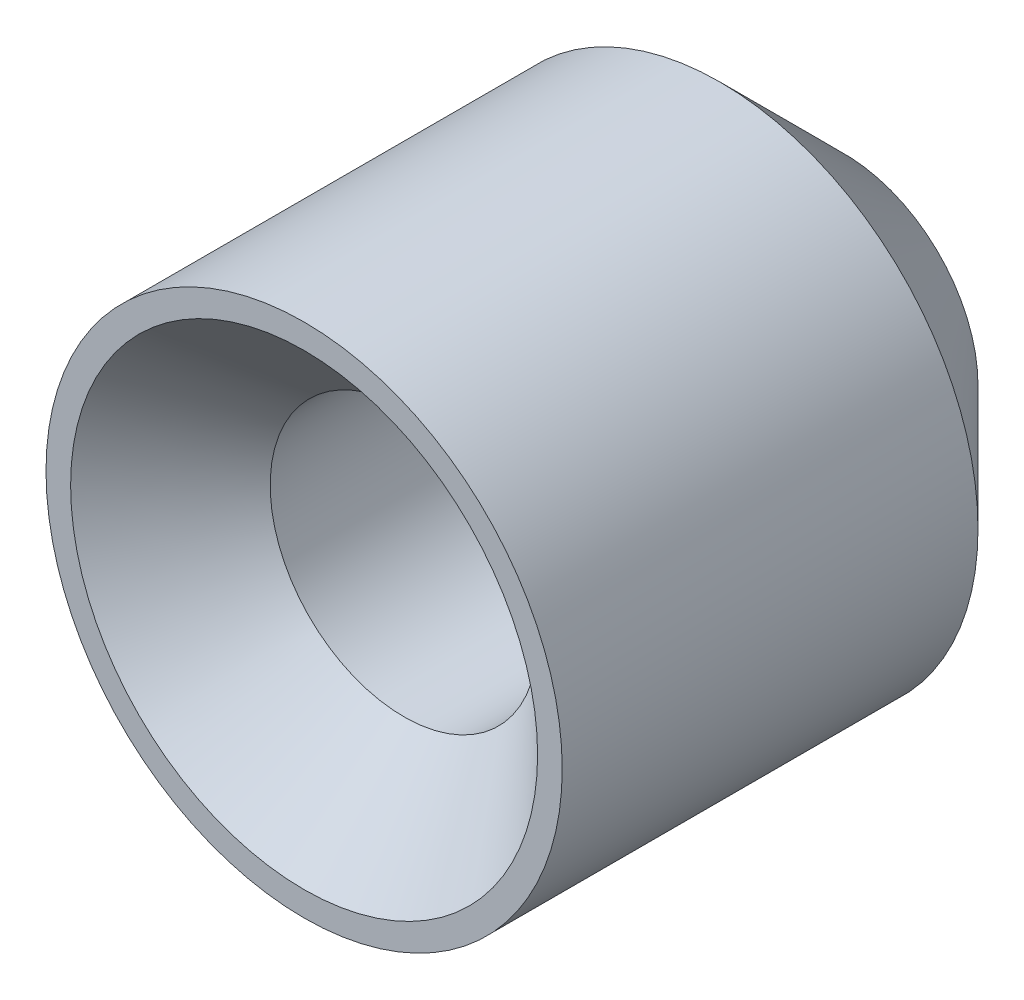
ISO-10303-21;
HEADER;
FILE_DESCRIPTION(('STEP AP214'),'2;1');
FILE_NAME('part.step','',(''),(''),'','','');
FILE_SCHEMA(('AUTOMOTIVE_DESIGN { 1 0 10303 214 1 1 1 1 }'));
ENDSEC;
DATA;
#1=APPLICATION_CONTEXT('core data for automotive mechanical design processes');
#2=APPLICATION_PROTOCOL_DEFINITION('international standard','automotive_design',2000,#1);
#3=PRODUCT_CONTEXT('',#1,'mechanical');
#4=PRODUCT('Part','Part','',(#3));
#5=PRODUCT_RELATED_PRODUCT_CATEGORY('part','',(#4));
#6=PRODUCT_DEFINITION_FORMATION('','',#4);
#7=PRODUCT_DEFINITION_CONTEXT('part definition',#1,'design');
#8=PRODUCT_DEFINITION('design','',#6,#7);
#9=PRODUCT_DEFINITION_SHAPE('','',#8);
#10=(LENGTH_UNIT() NAMED_UNIT(*) SI_UNIT(.MILLI.,.METRE.));
#11=(NAMED_UNIT(*) PLANE_ANGLE_UNIT() SI_UNIT($,.RADIAN.));
#12=(NAMED_UNIT(*) SI_UNIT($,.STERADIAN.) SOLID_ANGLE_UNIT());
#13=UNCERTAINTY_MEASURE_WITH_UNIT(LENGTH_MEASURE(1.E-05),#10,'distance_accuracy_value','');
#14=(GEOMETRIC_REPRESENTATION_CONTEXT(3) GLOBAL_UNCERTAINTY_ASSIGNED_CONTEXT((#13)) GLOBAL_UNIT_ASSIGNED_CONTEXT((#10,
#11,#12)) REPRESENTATION_CONTEXT('',''));
#15=CARTESIAN_POINT('',(0.,0.,0.));
#16=DIRECTION('',(0.,0.,1.));
#17=DIRECTION('',(1.,0.,0.));
#18=AXIS2_PLACEMENT_3D('',#15,#16,#17);
#19=CARTESIAN_POINT('',(-11.1939900407841,3.08591076799993,7.9375));
#20=DIRECTION('',(0.,0.,-1.));
#21=DIRECTION('',(-1.,0.,0.));
#22=AXIS2_PLACEMENT_3D('',#19,#20,#21);
#23=CYLINDRICAL_SURFACE('',#22,4.9276);
#24=CARTESIAN_POINT('',(-11.1939900407841,3.08591076799993,7.9375));
#25=DIRECTION('',(0.,0.,1.));
#26=DIRECTION('',(1.,0.,0.));
#27=AXIS2_PLACEMENT_3D('',#24,#25,#26);
#28=CIRCLE('',#27,4.9276);
#29=CARTESIAN_POINT('',(-6.26639004078405,3.08591076799993,7.9375));
#30=VERTEX_POINT('',#29);
#31=EDGE_CURVE('E10',#30,#30,#28,.T.);
#32=ORIENTED_EDGE('',*,*,#31,.F.);
#33=EDGE_LOOP('',(#32));
#34=FACE_BOUND('',#33,.T.);
#35=CARTESIAN_POINT('',(-11.1939900407841,3.08591076799993,0.));
#36=DIRECTION('',(0.,0.,-1.));
#37=DIRECTION('',(-1.,0.,0.));
#38=AXIS2_PLACEMENT_3D('',#35,#36,#37);
#39=CIRCLE('',#38,4.9276);
#40=CARTESIAN_POINT('',(-16.1215900407841,3.08591076799993,0.));
#41=VERTEX_POINT('',#40);
#42=EDGE_CURVE('E40',#41,#41,#39,.T.);
#43=ORIENTED_EDGE('',*,*,#42,.F.);
#44=EDGE_LOOP('',(#43));
#45=FACE_BOUND('',#44,.T.);
#46=ADVANCED_FACE('F33',(#34,#45),#23,.T.);
#47=CARTESIAN_POINT('',(-11.1939900407841,3.08591076799993,7.9375));
#48=DIRECTION('',(0.,0.,1.));
#49=DIRECTION('',(1.,0.,0.));
#50=AXIS2_PLACEMENT_3D('',#47,#48,#49);
#51=PLANE('',#50);
#52=CARTESIAN_POINT('',(-11.1939900407841,3.08591076799993,7.9375));
#53=DIRECTION('',(0.,0.,1.));
#54=DIRECTION('',(1.,0.,0.));
#55=AXIS2_PLACEMENT_3D('',#52,#53,#54);
#56=CIRCLE('',#55,4.4577);
#57=CARTESIAN_POINT('',(-6.73629004078405,3.08591076799993,7.9375));
#58=VERTEX_POINT('',#57);
#59=EDGE_CURVE('E49',#58,#58,#56,.T.);
#60=ORIENTED_EDGE('',*,*,#59,.F.);
#61=EDGE_LOOP('',(#60));
#62=FACE_BOUND('',#61,.T.);
#63=ORIENTED_EDGE('',*,*,#31,.T.);
#64=EDGE_LOOP('',(#63));
#65=FACE_BOUND('',#64,.T.);
#66=ADVANCED_FACE('F55',(#62,#65),#51,.T.);
#67=CARTESIAN_POINT('',(-11.1939900407841,3.08591076799993,0.));
#68=DIRECTION('',(0.,0.,1.));
#69=DIRECTION('',(-1.,0.,0.));
#70=AXIS2_PLACEMENT_3D('',#67,#68,#69);
#71=CONICAL_SURFACE('',#70,4.9276,0.78539816339745);
#72=CARTESIAN_POINT('',(-11.1939900407841,3.08591076799993,-2.3749));
#73=DIRECTION('',(0.,0.,1.));
#74=DIRECTION('',(1.,0.,0.));
#75=AXIS2_PLACEMENT_3D('',#72,#73,#74);
#76=CIRCLE('',#75,2.55269999999999);
#77=CARTESIAN_POINT('',(-8.64129004078406,3.08591076799993,-2.3749));
#78=VERTEX_POINT('',#77);
#79=EDGE_CURVE('E36',#78,#78,#76,.T.);
#80=ORIENTED_EDGE('',*,*,#79,.T.);
#81=EDGE_LOOP('',(#80));
#82=FACE_BOUND('',#81,.T.);
#83=ORIENTED_EDGE('',*,*,#42,.T.);
#84=EDGE_LOOP('',(#83));
#85=FACE_BOUND('',#84,.T.);
#86=ADVANCED_FACE('F57',(#82,#85),#71,.T.);
#87=CARTESIAN_POINT('',(-11.1939900407841,3.08591076799993,7.9375));
#88=DIRECTION('',(0.,0.,1.));
#89=DIRECTION('',(1.,0.,0.));
#90=AXIS2_PLACEMENT_3D('',#87,#88,#89);
#91=CYLINDRICAL_SURFACE('',#90,2.55269999999999);
#92=CARTESIAN_POINT('',(-11.1939900407841,3.08591076799993,6.0325));
#93=DIRECTION('',(0.,0.,1.));
#94=DIRECTION('',(1.,0.,0.));
#95=AXIS2_PLACEMENT_3D('',#92,#93,#94);
#96=CIRCLE('',#95,2.5527);
#97=CARTESIAN_POINT('',(-8.64129004078406,3.08591076799993,6.0325));
#98=VERTEX_POINT('',#97);
#99=EDGE_CURVE('E46',#98,#98,#96,.T.);
#100=ORIENTED_EDGE('',*,*,#99,.T.);
#101=EDGE_LOOP('',(#100));
#102=FACE_BOUND('',#101,.T.);
#103=ORIENTED_EDGE('',*,*,#79,.F.);
#104=EDGE_LOOP('',(#103));
#105=FACE_BOUND('',#104,.T.);
#106=ADVANCED_FACE('F62',(#102,#105),#91,.F.);
#107=CARTESIAN_POINT('',(-11.1939900407841,3.08591076799993,7.9375));
#108=DIRECTION('',(0.,0.,1.));
#109=DIRECTION('',(1.,0.,0.));
#110=AXIS2_PLACEMENT_3D('',#107,#108,#109);
#111=CONICAL_SURFACE('',#110,4.4577,0.785398163397449);
#112=ORIENTED_EDGE('',*,*,#99,.F.);
#113=EDGE_LOOP('',(#112));
#114=FACE_BOUND('',#113,.T.);
#115=ORIENTED_EDGE('',*,*,#59,.T.);
#116=EDGE_LOOP('',(#115));
#117=FACE_BOUND('',#116,.T.);
#118=ADVANCED_FACE('F53',(#114,#117),#111,.F.);
#119=CLOSED_SHELL('',(#46,#66,#86,#106,#118));
#120=MANIFOLD_SOLID_BREP('B2',#119);
#121=ADVANCED_BREP_SHAPE_REPRESENTATION('',(#18,#120),#14);
#122=SHAPE_DEFINITION_REPRESENTATION(#9,#121);
ENDSEC;
END-ISO-10303-21;
